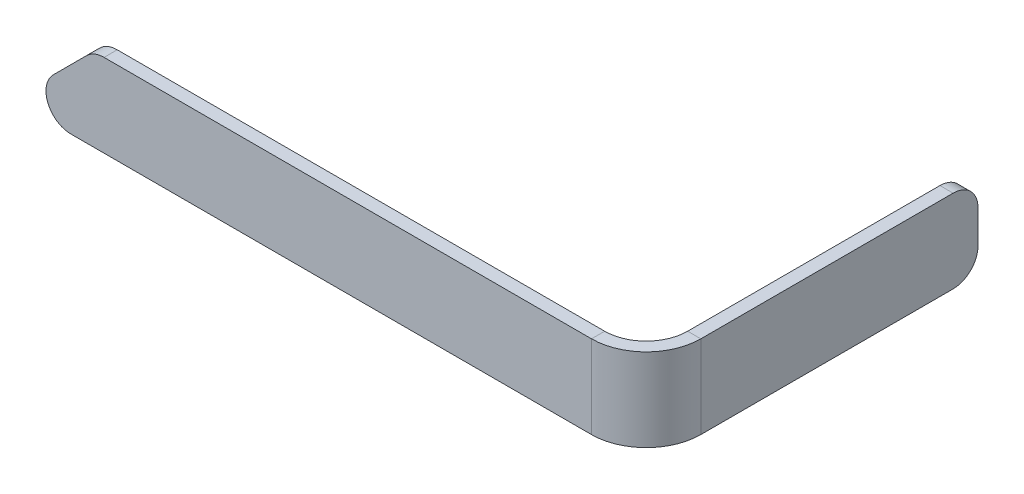
ISO-10303-21;
HEADER;
FILE_DESCRIPTION(('STEP AP214'),'2;1');
FILE_NAME('part.step','',(''),(''),'','','');
FILE_SCHEMA(('AUTOMOTIVE_DESIGN { 1 0 10303 214 1 1 1 1 }'));
ENDSEC;
DATA;
#1=APPLICATION_CONTEXT('core data for automotive mechanical design processes');
#2=APPLICATION_PROTOCOL_DEFINITION('international standard','automotive_design',2000,#1);
#3=PRODUCT_CONTEXT('',#1,'mechanical');
#4=PRODUCT('Part','Part','',(#3));
#5=PRODUCT_RELATED_PRODUCT_CATEGORY('part','',(#4));
#6=PRODUCT_DEFINITION_FORMATION('','',#4);
#7=PRODUCT_DEFINITION_CONTEXT('part definition',#1,'design');
#8=PRODUCT_DEFINITION('design','',#6,#7);
#9=PRODUCT_DEFINITION_SHAPE('','',#8);
#10=(LENGTH_UNIT() NAMED_UNIT(*) SI_UNIT(.MILLI.,.METRE.));
#11=(NAMED_UNIT(*) PLANE_ANGLE_UNIT() SI_UNIT($,.RADIAN.));
#12=(NAMED_UNIT(*) SI_UNIT($,.STERADIAN.) SOLID_ANGLE_UNIT());
#13=UNCERTAINTY_MEASURE_WITH_UNIT(LENGTH_MEASURE(1.E-05),#10,'distance_accuracy_value','');
#14=(GEOMETRIC_REPRESENTATION_CONTEXT(3) GLOBAL_UNCERTAINTY_ASSIGNED_CONTEXT((#13)) GLOBAL_UNIT_ASSIGNED_CONTEXT((#10,
#11,#12)) REPRESENTATION_CONTEXT('',''));
#15=CARTESIAN_POINT('',(0.,0.,0.));
#16=DIRECTION('',(0.,0.,1.));
#17=DIRECTION('',(1.,0.,0.));
#18=AXIS2_PLACEMENT_3D('',#15,#16,#17);
#19=CARTESIAN_POINT('',(-37.5,-5.,1.6));
#20=DIRECTION('',(0.,1.,0.));
#21=DIRECTION('',(1.,0.,0.));
#22=AXIS2_PLACEMENT_3D('',#19,#20,#21);
#23=PLANE('',#22);
#24=DIRECTION('',(1.,0.,0.));
#25=VECTOR('',#24,1.);
#26=CARTESIAN_POINT('',(-37.5,-5.,1.6));
#27=LINE('',#26,#25);
#28=CARTESIAN_POINT('',(-30.2573593128807,-5.,1.6));
#29=VERTEX_POINT('',#28);
#30=CARTESIAN_POINT('',(32.5,-5.,1.6));
#31=VERTEX_POINT('',#30);
#32=EDGE_CURVE('E200',#29,#31,#27,.T.);
#33=ORIENTED_EDGE('',*,*,#32,.F.);
#34=DIRECTION('',(0.,0.,1.));
#35=VECTOR('',#34,1.);
#36=CARTESIAN_POINT('',(-30.2573593128807,-5.,1.6));
#37=LINE('',#36,#35);
#38=CARTESIAN_POINT('',(-30.2573593128807,-5.,0.0125000000000001));
#39=VERTEX_POINT('',#38);
#40=EDGE_CURVE('E11',#29,#39,#37,.F.);
#41=ORIENTED_EDGE('',*,*,#40,.T.);
#42=DIRECTION('',(-1.,0.,0.));
#43=VECTOR('',#42,1.);
#44=CARTESIAN_POINT('',(0.,-5.,0.0125000000000001));
#45=LINE('',#44,#43);
#46=CARTESIAN_POINT('',(32.5,-5.,0.0125000000000001));
#47=VERTEX_POINT('',#46);
#48=EDGE_CURVE('E208',#39,#47,#45,.F.);
#49=ORIENTED_EDGE('',*,*,#48,.T.);
#50=DIRECTION('',(0.,0.,1.));
#51=VECTOR('',#50,1.);
#52=CARTESIAN_POINT('',(32.5,-5.,0.0124999999999952));
#53=LINE('',#52,#51);
#54=EDGE_CURVE('E184',#47,#31,#53,.T.);
#55=ORIENTED_EDGE('',*,*,#54,.T.);
#56=EDGE_LOOP('',(#33,#41,#49,#55));
#57=FACE_BOUND('',#56,.T.);
#58=ADVANCED_FACE('F42',(#57),#23,.F.);
#59=CARTESIAN_POINT('',(0.,0.,1.6));
#60=DIRECTION('',(0.,0.,-1.));
#61=DIRECTION('',(-1.,0.,0.));
#62=AXIS2_PLACEMENT_3D('',#59,#60,#61);
#63=PLANE('',#62);
#64=DIRECTION('',(-1.,0.,0.));
#65=VECTOR('',#64,1.);
#66=CARTESIAN_POINT('',(-37.5,5.,1.6));
#67=LINE('',#66,#65);
#68=CARTESIAN_POINT('',(32.5,5.,1.6));
#69=VERTEX_POINT('',#68);
#70=CARTESIAN_POINT('',(-26.2573593128808,5.,1.6));
#71=VERTEX_POINT('',#70);
#72=EDGE_CURVE('E203',#69,#71,#67,.T.);
#73=ORIENTED_EDGE('',*,*,#72,.T.);
#74=CARTESIAN_POINT('',(-26.2573593128808,2.,1.6));
#75=DIRECTION('',(0.,0.,-1.));
#76=DIRECTION('',(-1.,0.,0.));
#77=AXIS2_PLACEMENT_3D('',#74,#75,#76);
#78=CIRCLE('',#77,3.);
#79=CARTESIAN_POINT('',(-28.3786796564404,4.12132034355963,1.6));
#80=VERTEX_POINT('',#79);
#81=EDGE_CURVE('E233',#71,#80,#78,.F.);
#82=ORIENTED_EDGE('',*,*,#81,.T.);
#83=DIRECTION('',(0.707106781186546,0.707106781186549,0.));
#84=VECTOR('',#83,1.);
#85=CARTESIAN_POINT('',(-16.2500000000001,16.25,1.6));
#86=LINE('',#85,#84);
#87=CARTESIAN_POINT('',(-32.3786796564404,0.121320343559637,1.6));
#88=VERTEX_POINT('',#87);
#89=EDGE_CURVE('E198',#88,#80,#86,.T.);
#90=ORIENTED_EDGE('',*,*,#89,.F.);
#91=CARTESIAN_POINT('',(-30.2573593128807,-2.,1.6));
#92=DIRECTION('',(0.,0.,-1.));
#93=DIRECTION('',(-1.,0.,0.));
#94=AXIS2_PLACEMENT_3D('',#91,#92,#93);
#95=CIRCLE('',#94,3.);
#96=EDGE_CURVE('E231',#88,#29,#95,.F.);
#97=ORIENTED_EDGE('',*,*,#96,.T.);
#98=ORIENTED_EDGE('',*,*,#32,.T.);
#99=DIRECTION('',(0.,-1.,0.));
#100=VECTOR('',#99,1.);
#101=CARTESIAN_POINT('',(32.5,-5.,1.6));
#102=LINE('',#101,#100);
#103=EDGE_CURVE('E140',#31,#69,#102,.F.);
#104=ORIENTED_EDGE('',*,*,#103,.T.);
#105=EDGE_LOOP('',(#73,#82,#90,#97,#98,#104));
#106=FACE_BOUND('',#105,.T.);
#107=ADVANCED_FACE('F253',(#106),#63,.F.);
#108=CARTESIAN_POINT('',(0.,0.,0.0125000000000001));
#109=DIRECTION('',(0.,0.,-1.));
#110=DIRECTION('',(-1.,0.,0.));
#111=AXIS2_PLACEMENT_3D('',#108,#109,#110);
#112=PLANE('',#111);
#113=DIRECTION('',(0.707106781186546,0.707106781186549,0.));
#114=VECTOR('',#113,1.);
#115=CARTESIAN_POINT('',(-16.2500000000001,16.25,0.0125000000000001));
#116=LINE('',#115,#114);
#117=CARTESIAN_POINT('',(-32.3786796564404,0.121320343559637,0.0125000000000001));
#118=VERTEX_POINT('',#117);
#119=CARTESIAN_POINT('',(-28.3786796564404,4.12132034355963,0.0125000000000001));
#120=VERTEX_POINT('',#119);
#121=EDGE_CURVE('E195',#118,#120,#116,.T.);
#122=ORIENTED_EDGE('',*,*,#121,.T.);
#123=CARTESIAN_POINT('',(-26.2573593128808,2.,0.0125000000000001));
#124=DIRECTION('',(0.,0.,-1.));
#125=DIRECTION('',(-1.,0.,0.));
#126=AXIS2_PLACEMENT_3D('',#123,#124,#125);
#127=CIRCLE('',#126,3.);
#128=CARTESIAN_POINT('',(-26.2573593128808,5.,0.0125000000000001));
#129=VERTEX_POINT('',#128);
#130=EDGE_CURVE('E50',#120,#129,#127,.T.);
#131=ORIENTED_EDGE('',*,*,#130,.T.);
#132=DIRECTION('',(-1.,0.,0.));
#133=VECTOR('',#132,1.);
#134=CARTESIAN_POINT('',(0.,5.,0.0125000000000001));
#135=LINE('',#134,#133);
#136=CARTESIAN_POINT('',(32.5,5.,0.0124999999999952));
#137=VERTEX_POINT('',#136);
#138=EDGE_CURVE('E201',#137,#129,#135,.T.);
#139=ORIENTED_EDGE('',*,*,#138,.F.);
#140=DIRECTION('',(0.,-1.,0.));
#141=VECTOR('',#140,1.);
#142=CARTESIAN_POINT('',(32.5,-5.,0.0124999999999952));
#143=LINE('',#142,#141);
#144=EDGE_CURVE('E188',#47,#137,#143,.F.);
#145=ORIENTED_EDGE('',*,*,#144,.F.);
#146=ORIENTED_EDGE('',*,*,#48,.F.);
#147=CARTESIAN_POINT('',(-30.2573593128807,-2.,0.0125000000000001));
#148=DIRECTION('',(0.,0.,-1.));
#149=DIRECTION('',(-1.,0.,0.));
#150=AXIS2_PLACEMENT_3D('',#147,#148,#149);
#151=CIRCLE('',#150,3.);
#152=EDGE_CURVE('E239',#39,#118,#151,.T.);
#153=ORIENTED_EDGE('',*,*,#152,.T.);
#154=EDGE_LOOP('',(#122,#131,#139,#145,#146,#153));
#155=FACE_BOUND('',#154,.T.);
#156=ADVANCED_FACE('F243',(#155),#112,.T.);
#157=CARTESIAN_POINT('',(-37.5,5.,1.6));
#158=DIRECTION('',(0.,-1.,0.));
#159=DIRECTION('',(-1.,0.,0.));
#160=AXIS2_PLACEMENT_3D('',#157,#158,#159);
#161=PLANE('',#160);
#162=ORIENTED_EDGE('',*,*,#138,.T.);
#163=DIRECTION('',(0.,0.,1.));
#164=VECTOR('',#163,1.);
#165=CARTESIAN_POINT('',(-26.2573593128808,5.,1.6));
#166=LINE('',#165,#164);
#167=EDGE_CURVE('E228',#129,#71,#166,.T.);
#168=ORIENTED_EDGE('',*,*,#167,.T.);
#169=ORIENTED_EDGE('',*,*,#72,.F.);
#170=DIRECTION('',(0.,0.,1.));
#171=VECTOR('',#170,1.);
#172=CARTESIAN_POINT('',(32.5,5.,0.0124999999999952));
#173=LINE('',#172,#171);
#174=EDGE_CURVE('E192',#137,#69,#173,.T.);
#175=ORIENTED_EDGE('',*,*,#174,.F.);
#176=EDGE_LOOP('',(#162,#168,#169,#175));
#177=FACE_BOUND('',#176,.T.);
#178=ADVANCED_FACE('F248',(#177),#161,.F.);
#179=CARTESIAN_POINT('',(-16.2500000000001,16.25,1.6));
#180=DIRECTION('',(-0.707106781186549,0.707106781186546,0.));
#181=DIRECTION('',(0.707106781186546,0.707106781186549,0.));
#182=AXIS2_PLACEMENT_3D('',#179,#180,#181);
#183=PLANE('',#182);
#184=ORIENTED_EDGE('',*,*,#89,.T.);
#185=DIRECTION('',(0.,0.,-1.));
#186=VECTOR('',#185,1.);
#187=CARTESIAN_POINT('',(-28.3786796564404,4.12132034355964,1.6));
#188=LINE('',#187,#186);
#189=EDGE_CURVE('E63',#80,#120,#188,.T.);
#190=ORIENTED_EDGE('',*,*,#189,.T.);
#191=ORIENTED_EDGE('',*,*,#121,.F.);
#192=DIRECTION('',(0.,0.,-1.));
#193=VECTOR('',#192,1.);
#194=CARTESIAN_POINT('',(-32.3786796564404,0.12132034355964,1.6));
#195=LINE('',#194,#193);
#196=EDGE_CURVE('E235',#118,#88,#195,.F.);
#197=ORIENTED_EDGE('',*,*,#196,.T.);
#198=EDGE_LOOP('',(#184,#190,#191,#197));
#199=FACE_BOUND('',#198,.T.);
#200=ADVANCED_FACE('F254',(#199),#183,.T.);
#201=CARTESIAN_POINT('',(32.5,5.,-4.9875));
#202=DIRECTION('',(0.,1.,0.));
#203=DIRECTION('',(0.,0.,1.));
#204=AXIS2_PLACEMENT_3D('',#201,#202,#203);
#205=PLANE('',#204);
#206=DIRECTION('',(1.,0.,0.));
#207=VECTOR('',#206,1.);
#208=CARTESIAN_POINT('',(37.5,5.,-4.98749999999998));
#209=LINE('',#208,#207);
#210=CARTESIAN_POINT('',(37.5,5.,-4.98749999999998));
#211=VERTEX_POINT('',#210);
#212=CARTESIAN_POINT('',(39.0875,5.,-4.98749999999998));
#213=VERTEX_POINT('',#212);
#214=EDGE_CURVE('E264',#211,#213,#209,.T.);
#215=ORIENTED_EDGE('',*,*,#214,.F.);
#216=CARTESIAN_POINT('',(32.5,5.,-4.9875));
#217=DIRECTION('',(0.,-1.,0.));
#218=DIRECTION('',(0.,0.,-1.));
#219=AXIS2_PLACEMENT_3D('',#216,#217,#218);
#220=CIRCLE('',#219,5.);
#221=EDGE_CURVE('E143',#137,#211,#220,.F.);
#222=ORIENTED_EDGE('',*,*,#221,.F.);
#223=ORIENTED_EDGE('',*,*,#174,.T.);
#224=CARTESIAN_POINT('',(32.5,5.,-4.9875));
#225=DIRECTION('',(0.,-1.,0.));
#226=DIRECTION('',(0.,0.,-1.));
#227=AXIS2_PLACEMENT_3D('',#224,#225,#226);
#228=CIRCLE('',#227,6.5875);
#229=EDGE_CURVE('E183',#69,#213,#228,.F.);
#230=ORIENTED_EDGE('',*,*,#229,.T.);
#231=EDGE_LOOP('',(#215,#222,#223,#230));
#232=FACE_BOUND('',#231,.T.);
#233=ADVANCED_FACE('F272',(#232),#205,.T.);
#234=CARTESIAN_POINT('',(32.5,-5.,-4.9875));
#235=DIRECTION('',(0.,1.,0.));
#236=DIRECTION('',(0.,0.,1.));
#237=AXIS2_PLACEMENT_3D('',#234,#235,#236);
#238=PLANE('',#237);
#239=CARTESIAN_POINT('',(32.5,-5.,-4.9875));
#240=DIRECTION('',(0.,-1.,0.));
#241=DIRECTION('',(0.,0.,-1.));
#242=AXIS2_PLACEMENT_3D('',#239,#240,#241);
#243=CIRCLE('',#242,5.);
#244=CARTESIAN_POINT('',(37.5,-5.,-4.98749999999998));
#245=VERTEX_POINT('',#244);
#246=EDGE_CURVE('E150',#245,#47,#243,.T.);
#247=ORIENTED_EDGE('',*,*,#246,.F.);
#248=DIRECTION('',(1.,0.,0.));
#249=VECTOR('',#248,1.);
#250=CARTESIAN_POINT('',(37.5,-5.,-4.98749999999998));
#251=LINE('',#250,#249);
#252=CARTESIAN_POINT('',(39.0875,-5.,-4.98749999999998));
#253=VERTEX_POINT('',#252);
#254=EDGE_CURVE('E147',#245,#253,#251,.T.);
#255=ORIENTED_EDGE('',*,*,#254,.T.);
#256=CARTESIAN_POINT('',(32.5,-5.,-4.9875));
#257=DIRECTION('',(0.,-1.,0.));
#258=DIRECTION('',(0.,0.,-1.));
#259=AXIS2_PLACEMENT_3D('',#256,#257,#258);
#260=CIRCLE('',#259,6.5875);
#261=EDGE_CURVE('E133',#253,#31,#260,.T.);
#262=ORIENTED_EDGE('',*,*,#261,.T.);
#263=ORIENTED_EDGE('',*,*,#54,.F.);
#264=EDGE_LOOP('',(#247,#255,#262,#263));
#265=FACE_BOUND('',#264,.T.);
#266=ADVANCED_FACE('F148',(#265),#238,.F.);
#267=CARTESIAN_POINT('',(32.5,-5.,-4.9875));
#268=DIRECTION('',(0.,-1.,0.));
#269=DIRECTION('',(1.,0.,0.));
#270=AXIS2_PLACEMENT_3D('',#267,#268,#269);
#271=CYLINDRICAL_SURFACE('',#270,6.5875);
#272=ORIENTED_EDGE('',*,*,#103,.F.);
#273=ORIENTED_EDGE('',*,*,#261,.F.);
#274=DIRECTION('',(0.,1.,0.));
#275=VECTOR('',#274,1.);
#276=CARTESIAN_POINT('',(39.0875,0.,-4.98749999999998));
#277=LINE('',#276,#275);
#278=EDGE_CURVE('E138',#253,#213,#277,.T.);
#279=ORIENTED_EDGE('',*,*,#278,.T.);
#280=ORIENTED_EDGE('',*,*,#229,.F.);
#281=EDGE_LOOP('',(#272,#273,#279,#280));
#282=FACE_BOUND('',#281,.T.);
#283=ADVANCED_FACE('F135',(#282),#271,.T.);
#284=CARTESIAN_POINT('',(32.5,-5.,-4.9875));
#285=DIRECTION('',(0.,-1.,0.));
#286=DIRECTION('',(1.,0.,0.));
#287=AXIS2_PLACEMENT_3D('',#284,#285,#286);
#288=CYLINDRICAL_SURFACE('',#287,5.);
#289=ORIENTED_EDGE('',*,*,#144,.T.);
#290=ORIENTED_EDGE('',*,*,#221,.T.);
#291=DIRECTION('',(0.,-1.,0.));
#292=VECTOR('',#291,1.);
#293=CARTESIAN_POINT('',(37.5,5.,-4.98749999999998));
#294=LINE('',#293,#292);
#295=EDGE_CURVE('E155',#211,#245,#294,.T.);
#296=ORIENTED_EDGE('',*,*,#295,.T.);
#297=ORIENTED_EDGE('',*,*,#246,.T.);
#298=EDGE_LOOP('',(#289,#290,#296,#297));
#299=FACE_BOUND('',#298,.T.);
#300=ADVANCED_FACE('F259',(#299),#288,.F.);
#301=CARTESIAN_POINT('',(39.0875000000001,-5.,-38.4));
#302=DIRECTION('',(0.,1.,0.));
#303=DIRECTION('',(0.,0.,1.));
#304=AXIS2_PLACEMENT_3D('',#301,#302,#303);
#305=PLANE('',#304);
#306=DIRECTION('',(0.,0.,-1.));
#307=VECTOR('',#306,1.);
#308=CARTESIAN_POINT('',(37.5000000000001,-5.,-38.4));
#309=LINE('',#308,#307);
#310=CARTESIAN_POINT('',(37.5000000000001,-5.,-35.4));
#311=VERTEX_POINT('',#310);
#312=EDGE_CURVE('E164',#245,#311,#309,.T.);
#313=ORIENTED_EDGE('',*,*,#312,.T.);
#314=DIRECTION('',(-1.,0.,0.));
#315=VECTOR('',#314,1.);
#316=CARTESIAN_POINT('',(39.0875000000001,-5.,-35.4));
#317=LINE('',#316,#315);
#318=CARTESIAN_POINT('',(39.0875000000001,-5.,-35.4));
#319=VERTEX_POINT('',#318);
#320=EDGE_CURVE('E168',#311,#319,#317,.F.);
#321=ORIENTED_EDGE('',*,*,#320,.T.);
#322=DIRECTION('',(0.,0.,-1.));
#323=VECTOR('',#322,1.);
#324=CARTESIAN_POINT('',(39.0875000000001,-5.,-38.4));
#325=LINE('',#324,#323);
#326=EDGE_CURVE('E160',#253,#319,#325,.T.);
#327=ORIENTED_EDGE('',*,*,#326,.F.);
#328=ORIENTED_EDGE('',*,*,#254,.F.);
#329=EDGE_LOOP('',(#313,#321,#327,#328));
#330=FACE_BOUND('',#329,.T.);
#331=ADVANCED_FACE('F166',(#330),#305,.F.);
#332=CARTESIAN_POINT('',(39.0875,5.,0.0125000000000057));
#333=DIRECTION('',(0.,-1.,0.));
#334=DIRECTION('',(0.,0.,-1.));
#335=AXIS2_PLACEMENT_3D('',#332,#333,#334);
#336=PLANE('',#335);
#337=DIRECTION('',(0.,0.,1.));
#338=VECTOR('',#337,1.);
#339=CARTESIAN_POINT('',(39.0875,5.,0.0125000000000057));
#340=LINE('',#339,#338);
#341=CARTESIAN_POINT('',(39.0875000000001,5.,-35.4));
#342=VERTEX_POINT('',#341);
#343=EDGE_CURVE('E163',#342,#213,#340,.T.);
#344=ORIENTED_EDGE('',*,*,#343,.F.);
#345=DIRECTION('',(-1.,0.,0.));
#346=VECTOR('',#345,1.);
#347=CARTESIAN_POINT('',(39.0875000000001,5.,-35.4));
#348=LINE('',#347,#346);
#349=CARTESIAN_POINT('',(37.5000000000001,5.,-35.4));
#350=VERTEX_POINT('',#349);
#351=EDGE_CURVE('E225',#342,#350,#348,.T.);
#352=ORIENTED_EDGE('',*,*,#351,.T.);
#353=DIRECTION('',(0.,0.,1.));
#354=VECTOR('',#353,1.);
#355=CARTESIAN_POINT('',(37.5,5.,0.0125000000000001));
#356=LINE('',#355,#354);
#357=EDGE_CURVE('E170',#350,#211,#356,.T.);
#358=ORIENTED_EDGE('',*,*,#357,.T.);
#359=ORIENTED_EDGE('',*,*,#214,.T.);
#360=EDGE_LOOP('',(#344,#352,#358,#359));
#361=FACE_BOUND('',#360,.T.);
#362=ADVANCED_FACE('F269',(#361),#336,.F.);
#363=CARTESIAN_POINT('',(39.0875,0.,1.34249837761994E-13));
#364=DIRECTION('',(-1.,0.,0.));
#365=DIRECTION('',(0.,0.,1.));
#366=AXIS2_PLACEMENT_3D('',#363,#364,#365);
#367=PLANE('',#366);
#368=ORIENTED_EDGE('',*,*,#326,.T.);
#369=CARTESIAN_POINT('',(39.0875000000001,-2.,-35.4));
#370=DIRECTION('',(-1.,0.,0.));
#371=DIRECTION('',(0.,0.,1.));
#372=AXIS2_PLACEMENT_3D('',#369,#370,#371);
#373=CIRCLE('',#372,3.);
#374=CARTESIAN_POINT('',(39.0875000000001,-2.,-38.4));
#375=VERTEX_POINT('',#374);
#376=EDGE_CURVE('E223',#319,#375,#373,.F.);
#377=ORIENTED_EDGE('',*,*,#376,.T.);
#378=DIRECTION('',(0.,1.,0.));
#379=VECTOR('',#378,1.);
#380=CARTESIAN_POINT('',(39.0875000000001,5.,-38.4));
#381=LINE('',#380,#379);
#382=CARTESIAN_POINT('',(39.0875000000001,2.,-38.4));
#383=VERTEX_POINT('',#382);
#384=EDGE_CURVE('E169',#375,#383,#381,.T.);
#385=ORIENTED_EDGE('',*,*,#384,.T.);
#386=CARTESIAN_POINT('',(39.0875000000001,2.,-35.4));
#387=DIRECTION('',(-1.,0.,0.));
#388=DIRECTION('',(0.,0.,1.));
#389=AXIS2_PLACEMENT_3D('',#386,#387,#388);
#390=CIRCLE('',#389,3.);
#391=EDGE_CURVE('E221',#383,#342,#390,.F.);
#392=ORIENTED_EDGE('',*,*,#391,.T.);
#393=ORIENTED_EDGE('',*,*,#343,.T.);
#394=ORIENTED_EDGE('',*,*,#278,.F.);
#395=EDGE_LOOP('',(#368,#377,#385,#392,#393,#394));
#396=FACE_BOUND('',#395,.T.);
#397=ADVANCED_FACE('F159',(#396),#367,.F.);
#398=CARTESIAN_POINT('',(37.5,0.,1.28707111136581E-13));
#399=DIRECTION('',(-1.,0.,0.));
#400=DIRECTION('',(0.,0.,1.));
#401=AXIS2_PLACEMENT_3D('',#398,#399,#400);
#402=PLANE('',#401);
#403=DIRECTION('',(0.,1.,0.));
#404=VECTOR('',#403,1.);
#405=CARTESIAN_POINT('',(37.5000000000001,5.,-38.4));
#406=LINE('',#405,#404);
#407=CARTESIAN_POINT('',(37.5000000000001,-2.,-38.4));
#408=VERTEX_POINT('',#407);
#409=CARTESIAN_POINT('',(37.5000000000001,2.,-38.4));
#410=VERTEX_POINT('',#409);
#411=EDGE_CURVE('E174',#408,#410,#406,.T.);
#412=ORIENTED_EDGE('',*,*,#411,.F.);
#413=CARTESIAN_POINT('',(37.5000000000001,-2.,-35.4));
#414=DIRECTION('',(-1.,0.,0.));
#415=DIRECTION('',(0.,0.,1.));
#416=AXIS2_PLACEMENT_3D('',#413,#414,#415);
#417=CIRCLE('',#416,3.);
#418=EDGE_CURVE('E218',#408,#311,#417,.T.);
#419=ORIENTED_EDGE('',*,*,#418,.T.);
#420=ORIENTED_EDGE('',*,*,#312,.F.);
#421=ORIENTED_EDGE('',*,*,#295,.F.);
#422=ORIENTED_EDGE('',*,*,#357,.F.);
#423=CARTESIAN_POINT('',(37.5000000000001,2.,-35.4));
#424=DIRECTION('',(-1.,0.,0.));
#425=DIRECTION('',(0.,0.,1.));
#426=AXIS2_PLACEMENT_3D('',#423,#424,#425);
#427=CIRCLE('',#426,3.);
#428=EDGE_CURVE('E216',#350,#410,#427,.T.);
#429=ORIENTED_EDGE('',*,*,#428,.T.);
#430=EDGE_LOOP('',(#412,#419,#420,#421,#422,#429));
#431=FACE_BOUND('',#430,.T.);
#432=ADVANCED_FACE('F335',(#431),#402,.T.);
#433=CARTESIAN_POINT('',(39.0875000000001,5.,-38.4));
#434=DIRECTION('',(0.,0.,1.));
#435=DIRECTION('',(1.,0.,0.));
#436=AXIS2_PLACEMENT_3D('',#433,#434,#435);
#437=PLANE('',#436);
#438=ORIENTED_EDGE('',*,*,#384,.F.);
#439=DIRECTION('',(-1.,0.,0.));
#440=VECTOR('',#439,1.);
#441=CARTESIAN_POINT('',(39.0875000000001,-2.,-38.4));
#442=LINE('',#441,#440);
#443=EDGE_CURVE('E213',#375,#408,#442,.T.);
#444=ORIENTED_EDGE('',*,*,#443,.T.);
#445=ORIENTED_EDGE('',*,*,#411,.T.);
#446=DIRECTION('',(-1.,0.,0.));
#447=VECTOR('',#446,1.);
#448=CARTESIAN_POINT('',(39.0875000000001,2.,-38.4));
#449=LINE('',#448,#447);
#450=EDGE_CURVE('E206',#410,#383,#449,.F.);
#451=ORIENTED_EDGE('',*,*,#450,.T.);
#452=EDGE_LOOP('',(#438,#444,#445,#451));
#453=FACE_BOUND('',#452,.T.);
#454=ADVANCED_FACE('F296',(#453),#437,.F.);
#455=CARTESIAN_POINT('',(39.0875000000001,-2.,-35.4));
#456=DIRECTION('',(-1.,0.,0.));
#457=DIRECTION('',(0.,0.,1.));
#458=AXIS2_PLACEMENT_3D('',#455,#456,#457);
#459=CYLINDRICAL_SURFACE('',#458,3.);
#460=ORIENTED_EDGE('',*,*,#376,.F.);
#461=ORIENTED_EDGE('',*,*,#320,.F.);
#462=ORIENTED_EDGE('',*,*,#418,.F.);
#463=ORIENTED_EDGE('',*,*,#443,.F.);
#464=EDGE_LOOP('',(#460,#461,#462,#463));
#465=FACE_BOUND('',#464,.T.);
#466=ADVANCED_FACE('F292',(#465),#459,.T.);
#467=CARTESIAN_POINT('',(39.0875000000001,2.,-35.4));
#468=DIRECTION('',(-1.,0.,0.));
#469=DIRECTION('',(0.,0.,1.));
#470=AXIS2_PLACEMENT_3D('',#467,#468,#469);
#471=CYLINDRICAL_SURFACE('',#470,3.);
#472=ORIENTED_EDGE('',*,*,#391,.F.);
#473=ORIENTED_EDGE('',*,*,#450,.F.);
#474=ORIENTED_EDGE('',*,*,#428,.F.);
#475=ORIENTED_EDGE('',*,*,#351,.F.);
#476=EDGE_LOOP('',(#472,#473,#474,#475));
#477=FACE_BOUND('',#476,.T.);
#478=ADVANCED_FACE('F295',(#477),#471,.T.);
#479=CARTESIAN_POINT('',(-26.2573593128808,2.,1.6));
#480=DIRECTION('',(0.,0.,-1.));
#481=DIRECTION('',(-1.,0.,0.));
#482=AXIS2_PLACEMENT_3D('',#479,#480,#481);
#483=CYLINDRICAL_SURFACE('',#482,3.);
#484=ORIENTED_EDGE('',*,*,#130,.F.);
#485=ORIENTED_EDGE('',*,*,#189,.F.);
#486=ORIENTED_EDGE('',*,*,#81,.F.);
#487=ORIENTED_EDGE('',*,*,#167,.F.);
#488=EDGE_LOOP('',(#484,#485,#486,#487));
#489=FACE_BOUND('',#488,.T.);
#490=ADVANCED_FACE('F250',(#489),#483,.T.);
#491=CARTESIAN_POINT('',(-30.2573593128807,-2.,1.6));
#492=DIRECTION('',(0.,0.,-1.));
#493=DIRECTION('',(-1.,0.,0.));
#494=AXIS2_PLACEMENT_3D('',#491,#492,#493);
#495=CYLINDRICAL_SURFACE('',#494,3.);
#496=ORIENTED_EDGE('',*,*,#152,.F.);
#497=ORIENTED_EDGE('',*,*,#40,.F.);
#498=ORIENTED_EDGE('',*,*,#96,.F.);
#499=ORIENTED_EDGE('',*,*,#196,.F.);
#500=EDGE_LOOP('',(#496,#497,#498,#499));
#501=FACE_BOUND('',#500,.T.);
#502=ADVANCED_FACE('F44',(#501),#495,.T.);
#503=CLOSED_SHELL('',(#58,#107,#156,#178,#200,#233,#266,#283,#300,#331,#362,#397,#432,#454,#466,
#478,#490,#502));
#504=MANIFOLD_SOLID_BREP('B2',#503);
#505=ADVANCED_BREP_SHAPE_REPRESENTATION('',(#18,#504),#14);
#506=SHAPE_DEFINITION_REPRESENTATION(#9,#505);
ENDSEC;
END-ISO-10303-21;
